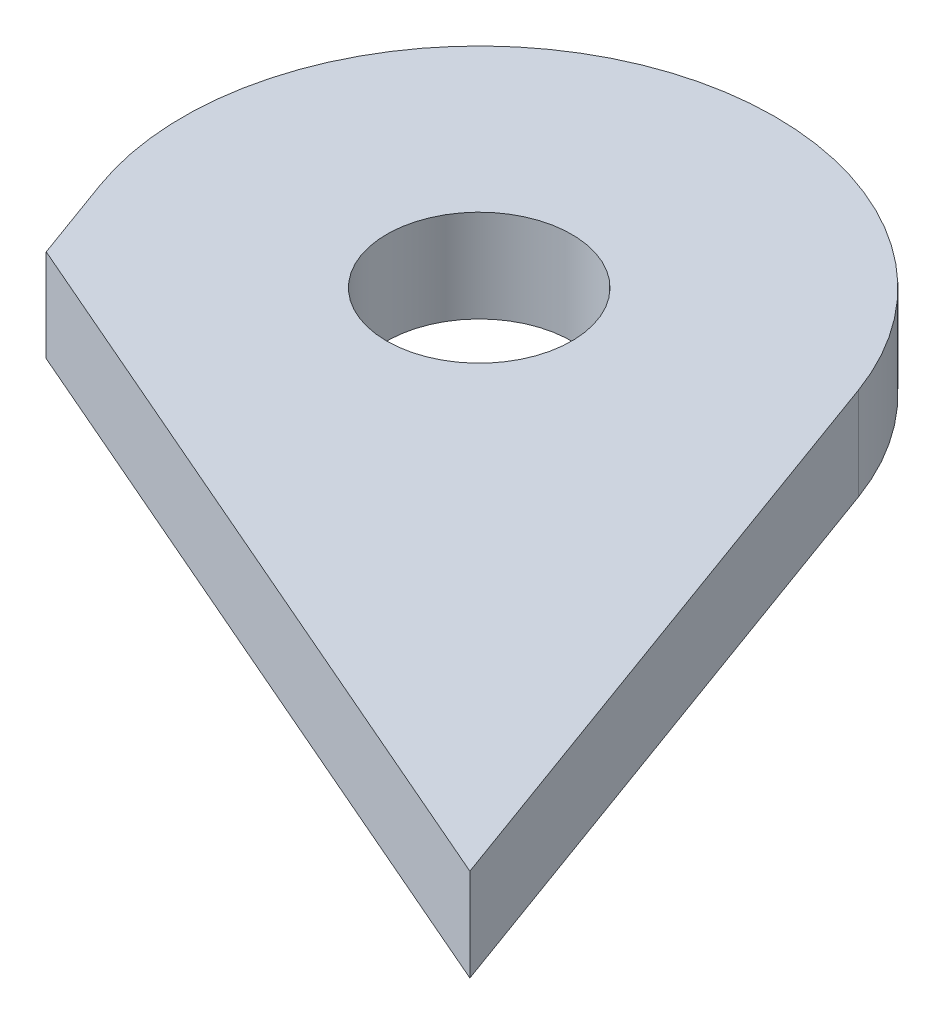
ISO-10303-21;
HEADER;
FILE_DESCRIPTION(('STEP AP214'),'2;1');
FILE_NAME('part.step','',(''),(''),'','','');
FILE_SCHEMA(('AUTOMOTIVE_DESIGN { 1 0 10303 214 1 1 1 1 }'));
ENDSEC;
DATA;
#1=APPLICATION_CONTEXT('core data for automotive mechanical design processes');
#2=APPLICATION_PROTOCOL_DEFINITION('international standard','automotive_design',2000,#1);
#3=PRODUCT_CONTEXT('',#1,'mechanical');
#4=PRODUCT('Part','Part','',(#3));
#5=PRODUCT_RELATED_PRODUCT_CATEGORY('part','',(#4));
#6=PRODUCT_DEFINITION_FORMATION('','',#4);
#7=PRODUCT_DEFINITION_CONTEXT('part definition',#1,'design');
#8=PRODUCT_DEFINITION('design','',#6,#7);
#9=PRODUCT_DEFINITION_SHAPE('','',#8);
#10=(LENGTH_UNIT() NAMED_UNIT(*) SI_UNIT(.MILLI.,.METRE.));
#11=(NAMED_UNIT(*) PLANE_ANGLE_UNIT() SI_UNIT($,.RADIAN.));
#12=(NAMED_UNIT(*) SI_UNIT($,.STERADIAN.) SOLID_ANGLE_UNIT());
#13=UNCERTAINTY_MEASURE_WITH_UNIT(LENGTH_MEASURE(1.E-05),#10,'distance_accuracy_value','');
#14=(GEOMETRIC_REPRESENTATION_CONTEXT(3) GLOBAL_UNCERTAINTY_ASSIGNED_CONTEXT((#13)) GLOBAL_UNIT_ASSIGNED_CONTEXT((#10,
#11,#12)) REPRESENTATION_CONTEXT('',''));
#15=CARTESIAN_POINT('',(0.,0.,0.));
#16=DIRECTION('',(0.,0.,1.));
#17=DIRECTION('',(1.,0.,0.));
#18=AXIS2_PLACEMENT_3D('',#15,#16,#17);
#19=CARTESIAN_POINT('',(0.,6.35,0.));
#20=DIRECTION('',(0.,1.,0.));
#21=DIRECTION('',(0.,0.,1.));
#22=AXIS2_PLACEMENT_3D('',#19,#20,#21);
#23=PLANE('',#22);
#24=CARTESIAN_POINT('',(0.,6.35,0.));
#25=DIRECTION('',(0.,1.,0.));
#26=DIRECTION('',(0.,0.,1.));
#27=AXIS2_PLACEMENT_3D('',#24,#25,#26);
#28=CIRCLE('',#27,20.32);
#29=CARTESIAN_POINT('',(19.0945540543697,6.35,-6.94984931237753));
#30=VERTEX_POINT('',#29);
#31=CARTESIAN_POINT('',(-19.0945540543697,6.35,6.94984931237754));
#32=VERTEX_POINT('',#31);
#33=EDGE_CURVE('E98',#30,#32,#28,.T.);
#34=ORIENTED_EDGE('',*,*,#33,.T.);
#35=DIRECTION('',(0.342020143325666,0.,0.939692620785909));
#36=VECTOR('',#35,1.);
#37=CARTESIAN_POINT('',(-19.0945540543697,6.35,6.94984931237754));
#38=LINE('',#37,#36);
#39=CARTESIAN_POINT('',(-16.9908861663033,6.35,12.7296293328718));
#40=VERTEX_POINT('',#39);
#41=EDGE_CURVE('E93',#32,#40,#38,.T.);
#42=ORIENTED_EDGE('',*,*,#41,.T.);
#43=DIRECTION('',(0.917407699357491,0.,0.397948631307604));
#44=VECTOR('',#43,1.);
#45=CARTESIAN_POINT('',(34.3655094472471,6.35,35.0067558030524));
#46=LINE('',#45,#44);
#47=CARTESIAN_POINT('',(34.3655094472471,6.35,35.0067558030524));
#48=VERTEX_POINT('',#47);
#49=EDGE_CURVE('E96',#40,#48,#46,.T.);
#50=ORIENTED_EDGE('',*,*,#49,.T.);
#51=DIRECTION('',(-0.342020143325666,0.,-0.939692620785909));
#52=VECTOR('',#51,1.);
#53=CARTESIAN_POINT('',(19.0945540543697,6.35,-6.94984931237753));
#54=LINE('',#53,#52);
#55=EDGE_CURVE('E63',#48,#30,#54,.T.);
#56=ORIENTED_EDGE('',*,*,#55,.T.);
#57=EDGE_LOOP('',(#34,#42,#50,#56));
#58=FACE_BOUND('',#57,.T.);
#59=CARTESIAN_POINT('',(0.,6.35,0.));
#60=DIRECTION('',(0.,1.,0.));
#61=DIRECTION('',(0.,0.,1.));
#62=AXIS2_PLACEMENT_3D('',#59,#60,#61);
#63=CIRCLE('',#62,6.35);
#64=CARTESIAN_POINT('',(0.,6.35,6.35));
#65=VERTEX_POINT('',#64);
#66=EDGE_CURVE('E118',#65,#65,#63,.T.);
#67=ORIENTED_EDGE('',*,*,#66,.F.);
#68=EDGE_LOOP('',(#67));
#69=FACE_BOUND('',#68,.T.);
#70=ADVANCED_FACE('F45',(#58,#69),#23,.T.);
#71=CARTESIAN_POINT('',(0.,0.,0.));
#72=DIRECTION('',(0.,1.,0.));
#73=DIRECTION('',(0.,0.,1.));
#74=AXIS2_PLACEMENT_3D('',#71,#72,#73);
#75=PLANE('',#74);
#76=CARTESIAN_POINT('',(0.,0.,0.));
#77=DIRECTION('',(0.,1.,0.));
#78=DIRECTION('',(0.,0.,1.));
#79=AXIS2_PLACEMENT_3D('',#76,#77,#78);
#80=CIRCLE('',#79,20.32);
#81=CARTESIAN_POINT('',(19.0945540543697,0.,-6.94984931237753));
#82=VERTEX_POINT('',#81);
#83=CARTESIAN_POINT('',(-19.0945540543697,0.,6.94984931237754));
#84=VERTEX_POINT('',#83);
#85=EDGE_CURVE('E114',#82,#84,#80,.T.);
#86=ORIENTED_EDGE('',*,*,#85,.F.);
#87=DIRECTION('',(-0.342020143325666,0.,-0.939692620785909));
#88=VECTOR('',#87,1.);
#89=CARTESIAN_POINT('',(19.0945540543697,0.,-6.94984931237753));
#90=LINE('',#89,#88);
#91=CARTESIAN_POINT('',(34.3655094472471,0.,35.0067558030524));
#92=VERTEX_POINT('',#91);
#93=EDGE_CURVE('E86',#92,#82,#90,.T.);
#94=ORIENTED_EDGE('',*,*,#93,.F.);
#95=DIRECTION('',(0.917407699357491,0.,0.397948631307604));
#96=VECTOR('',#95,1.);
#97=CARTESIAN_POINT('',(34.3655094472471,0.,35.0067558030524));
#98=LINE('',#97,#96);
#99=CARTESIAN_POINT('',(-16.9908861663033,0.,12.7296293328718));
#100=VERTEX_POINT('',#99);
#101=EDGE_CURVE('E80',#100,#92,#98,.T.);
#102=ORIENTED_EDGE('',*,*,#101,.F.);
#103=DIRECTION('',(0.342020143325666,0.,0.939692620785909));
#104=VECTOR('',#103,1.);
#105=CARTESIAN_POINT('',(-19.0945540543697,0.,6.94984931237754));
#106=LINE('',#105,#104);
#107=EDGE_CURVE('E103',#84,#100,#106,.T.);
#108=ORIENTED_EDGE('',*,*,#107,.F.);
#109=EDGE_LOOP('',(#86,#94,#102,#108));
#110=FACE_BOUND('',#109,.T.);
#111=CARTESIAN_POINT('',(0.,0.,0.));
#112=DIRECTION('',(0.,1.,0.));
#113=DIRECTION('',(0.,0.,1.));
#114=AXIS2_PLACEMENT_3D('',#111,#112,#113);
#115=CIRCLE('',#114,6.35);
#116=CARTESIAN_POINT('',(0.,0.,6.35));
#117=VERTEX_POINT('',#116);
#118=EDGE_CURVE('E136',#117,#117,#115,.T.);
#119=ORIENTED_EDGE('',*,*,#118,.T.);
#120=EDGE_LOOP('',(#119));
#121=FACE_BOUND('',#120,.T.);
#122=ADVANCED_FACE('F131',(#110,#121),#75,.F.);
#123=CARTESIAN_POINT('',(0.,6.35,0.));
#124=DIRECTION('',(0.,-1.,0.));
#125=DIRECTION('',(0.,0.,-1.));
#126=AXIS2_PLACEMENT_3D('',#123,#124,#125);
#127=CYLINDRICAL_SURFACE('',#126,20.32);
#128=ORIENTED_EDGE('',*,*,#85,.T.);
#129=DIRECTION('',(0.,-1.,0.));
#130=VECTOR('',#129,1.);
#131=CARTESIAN_POINT('',(-19.0945540543697,6.35,6.94984931237754));
#132=LINE('',#131,#130);
#133=EDGE_CURVE('E11',#32,#84,#132,.T.);
#134=ORIENTED_EDGE('',*,*,#133,.F.);
#135=ORIENTED_EDGE('',*,*,#33,.F.);
#136=DIRECTION('',(0.,-1.,0.));
#137=VECTOR('',#136,1.);
#138=CARTESIAN_POINT('',(19.0945540543697,6.35,-6.94984931237753));
#139=LINE('',#138,#137);
#140=EDGE_CURVE('E110',#30,#82,#139,.T.);
#141=ORIENTED_EDGE('',*,*,#140,.T.);
#142=EDGE_LOOP('',(#128,#134,#135,#141));
#143=FACE_BOUND('',#142,.T.);
#144=ADVANCED_FACE('F47',(#143),#127,.T.);
#145=CARTESIAN_POINT('',(-19.0945540543697,6.35,6.94984931237754));
#146=DIRECTION('',(0.939692620785909,0.,-0.342020143325666));
#147=DIRECTION('',(-0.342020143325666,0.,-0.939692620785909));
#148=AXIS2_PLACEMENT_3D('',#145,#146,#147);
#149=PLANE('',#148);
#150=ORIENTED_EDGE('',*,*,#107,.T.);
#151=DIRECTION('',(0.,-1.,0.));
#152=VECTOR('',#151,1.);
#153=CARTESIAN_POINT('',(-16.9908861663033,6.35,12.7296293328718));
#154=LINE('',#153,#152);
#155=EDGE_CURVE('E55',#40,#100,#154,.T.);
#156=ORIENTED_EDGE('',*,*,#155,.F.);
#157=ORIENTED_EDGE('',*,*,#41,.F.);
#158=ORIENTED_EDGE('',*,*,#133,.T.);
#159=EDGE_LOOP('',(#150,#156,#157,#158));
#160=FACE_BOUND('',#159,.T.);
#161=ADVANCED_FACE('F102',(#160),#149,.F.);
#162=CARTESIAN_POINT('',(34.3655094472471,6.35,35.0067558030524));
#163=DIRECTION('',(0.397948631307604,0.,-0.917407699357491));
#164=DIRECTION('',(-0.917407699357491,0.,-0.397948631307604));
#165=AXIS2_PLACEMENT_3D('',#162,#163,#164);
#166=PLANE('',#165);
#167=ORIENTED_EDGE('',*,*,#101,.T.);
#168=DIRECTION('',(0.,-1.,0.));
#169=VECTOR('',#168,1.);
#170=CARTESIAN_POINT('',(34.3655094472471,6.35,35.0067558030524));
#171=LINE('',#170,#169);
#172=EDGE_CURVE('E105',#48,#92,#171,.T.);
#173=ORIENTED_EDGE('',*,*,#172,.F.);
#174=ORIENTED_EDGE('',*,*,#49,.F.);
#175=ORIENTED_EDGE('',*,*,#155,.T.);
#176=EDGE_LOOP('',(#167,#173,#174,#175));
#177=FACE_BOUND('',#176,.T.);
#178=ADVANCED_FACE('F106',(#177),#166,.F.);
#179=CARTESIAN_POINT('',(19.0945540543697,6.35,-6.94984931237753));
#180=DIRECTION('',(-0.939692620785909,0.,0.342020143325666));
#181=DIRECTION('',(0.342020143325666,0.,0.939692620785909));
#182=AXIS2_PLACEMENT_3D('',#179,#180,#181);
#183=PLANE('',#182);
#184=ORIENTED_EDGE('',*,*,#93,.T.);
#185=ORIENTED_EDGE('',*,*,#140,.F.);
#186=ORIENTED_EDGE('',*,*,#55,.F.);
#187=ORIENTED_EDGE('',*,*,#172,.T.);
#188=EDGE_LOOP('',(#184,#185,#186,#187));
#189=FACE_BOUND('',#188,.T.);
#190=ADVANCED_FACE('F128',(#189),#183,.F.);
#191=CARTESIAN_POINT('',(0.,6.35,0.));
#192=DIRECTION('',(0.,-1.,0.));
#193=DIRECTION('',(0.,0.,-1.));
#194=AXIS2_PLACEMENT_3D('',#191,#192,#193);
#195=CYLINDRICAL_SURFACE('',#194,6.35);
#196=ORIENTED_EDGE('',*,*,#66,.T.);
#197=EDGE_LOOP('',(#196));
#198=FACE_BOUND('',#197,.T.);
#199=ORIENTED_EDGE('',*,*,#118,.F.);
#200=EDGE_LOOP('',(#199));
#201=FACE_BOUND('',#200,.T.);
#202=ADVANCED_FACE('F144',(#198,#201),#195,.F.);
#203=CLOSED_SHELL('',(#70,#122,#144,#161,#178,#190,#202));
#204=MANIFOLD_SOLID_BREP('B2',#203);
#205=ADVANCED_BREP_SHAPE_REPRESENTATION('',(#18,#204),#14);
#206=SHAPE_DEFINITION_REPRESENTATION(#9,#205);
ENDSEC;
END-ISO-10303-21;
